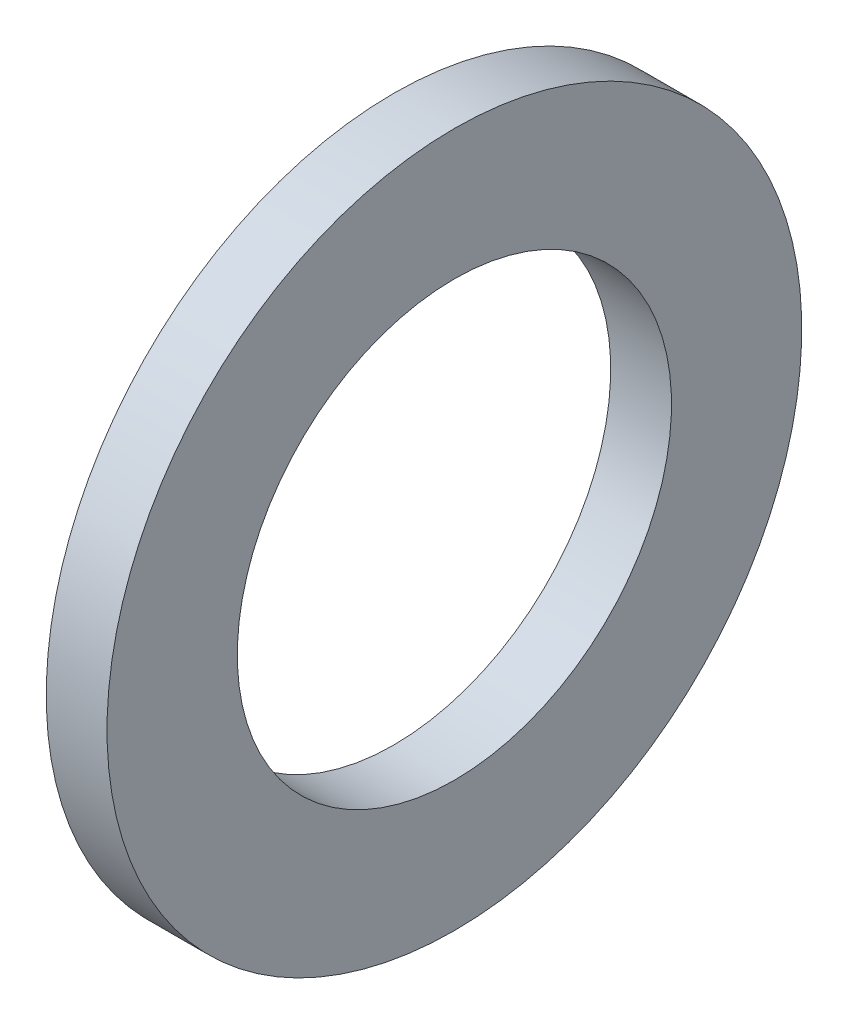
ISO-10303-21;
HEADER;
FILE_DESCRIPTION(('STEP AP214'),'2;1');
FILE_NAME('part.step','',(''),(''),'','','');
FILE_SCHEMA(('AUTOMOTIVE_DESIGN { 1 0 10303 214 1 1 1 1 }'));
ENDSEC;
DATA;
#1=APPLICATION_CONTEXT('core data for automotive mechanical design processes');
#2=APPLICATION_PROTOCOL_DEFINITION('international standard','automotive_design',2000,#1);
#3=PRODUCT_CONTEXT('',#1,'mechanical');
#4=PRODUCT('Part','Part','',(#3));
#5=PRODUCT_RELATED_PRODUCT_CATEGORY('part','',(#4));
#6=PRODUCT_DEFINITION_FORMATION('','',#4);
#7=PRODUCT_DEFINITION_CONTEXT('part definition',#1,'design');
#8=PRODUCT_DEFINITION('design','',#6,#7);
#9=PRODUCT_DEFINITION_SHAPE('','',#8);
#10=(LENGTH_UNIT() NAMED_UNIT(*) SI_UNIT(.MILLI.,.METRE.));
#11=(NAMED_UNIT(*) PLANE_ANGLE_UNIT() SI_UNIT($,.RADIAN.));
#12=(NAMED_UNIT(*) SI_UNIT($,.STERADIAN.) SOLID_ANGLE_UNIT());
#13=UNCERTAINTY_MEASURE_WITH_UNIT(LENGTH_MEASURE(1.E-05),#10,'distance_accuracy_value','');
#14=(GEOMETRIC_REPRESENTATION_CONTEXT(3) GLOBAL_UNCERTAINTY_ASSIGNED_CONTEXT((#13)) GLOBAL_UNIT_ASSIGNED_CONTEXT((#10,
#11,#12)) REPRESENTATION_CONTEXT('',''));
#15=CARTESIAN_POINT('',(0.,0.,0.));
#16=DIRECTION('',(0.,0.,1.));
#17=DIRECTION('',(1.,0.,0.));
#18=AXIS2_PLACEMENT_3D('',#15,#16,#17);
#19=CARTESIAN_POINT('',(0.7,0.,0.));
#20=DIRECTION('',(1.,0.,0.));
#21=DIRECTION('',(0.,-1.,0.));
#22=AXIS2_PLACEMENT_3D('',#19,#20,#21);
#23=PLANE('',#22);
#24=CARTESIAN_POINT('',(0.7,0.,0.));
#25=DIRECTION('',(1.,0.,0.));
#26=DIRECTION('',(0.,1.,0.));
#27=AXIS2_PLACEMENT_3D('',#24,#25,#26);
#28=CIRCLE('',#27,2.5);
#29=CARTESIAN_POINT('',(0.7,2.5,0.));
#30=VERTEX_POINT('',#29);
#31=EDGE_CURVE('E19',#30,#30,#28,.T.);
#32=ORIENTED_EDGE('',*,*,#31,.F.);
#33=EDGE_LOOP('',(#32));
#34=FACE_BOUND('',#33,.T.);
#35=CARTESIAN_POINT('',(0.7,0.,0.));
#36=DIRECTION('',(1.,0.,0.));
#37=DIRECTION('',(0.,1.,0.));
#38=AXIS2_PLACEMENT_3D('',#35,#36,#37);
#39=CIRCLE('',#38,4.);
#40=CARTESIAN_POINT('',(0.7,4.,0.));
#41=VERTEX_POINT('',#40);
#42=EDGE_CURVE('E57',#41,#41,#39,.T.);
#43=ORIENTED_EDGE('',*,*,#42,.T.);
#44=EDGE_LOOP('',(#43));
#45=FACE_BOUND('',#44,.T.);
#46=ADVANCED_FACE('F16',(#34,#45),#23,.T.);
#47=CARTESIAN_POINT('',(0.,0.,0.));
#48=DIRECTION('',(1.,0.,0.));
#49=DIRECTION('',(0.,-1.,0.));
#50=AXIS2_PLACEMENT_3D('',#47,#48,#49);
#51=PLANE('',#50);
#52=CARTESIAN_POINT('',(0.,0.,0.));
#53=DIRECTION('',(1.,0.,0.));
#54=DIRECTION('',(0.,1.,0.));
#55=AXIS2_PLACEMENT_3D('',#52,#53,#54);
#56=CIRCLE('',#55,2.5);
#57=CARTESIAN_POINT('',(0.,2.5,0.));
#58=VERTEX_POINT('',#57);
#59=EDGE_CURVE('E10',#58,#58,#56,.T.);
#60=ORIENTED_EDGE('',*,*,#59,.T.);
#61=EDGE_LOOP('',(#60));
#62=FACE_BOUND('',#61,.T.);
#63=CARTESIAN_POINT('',(0.,0.,0.));
#64=DIRECTION('',(1.,0.,0.));
#65=DIRECTION('',(0.,1.,0.));
#66=AXIS2_PLACEMENT_3D('',#63,#64,#65);
#67=CIRCLE('',#66,4.);
#68=CARTESIAN_POINT('',(0.,4.,0.));
#69=VERTEX_POINT('',#68);
#70=EDGE_CURVE('E56',#69,#69,#67,.T.);
#71=ORIENTED_EDGE('',*,*,#70,.F.);
#72=EDGE_LOOP('',(#71));
#73=FACE_BOUND('',#72,.T.);
#74=ADVANCED_FACE('F85',(#62,#73),#51,.F.);
#75=CARTESIAN_POINT('',(0.,0.,0.));
#76=DIRECTION('',(-1.,0.,0.));
#77=DIRECTION('',(0.,1.,0.));
#78=AXIS2_PLACEMENT_3D('',#75,#76,#77);
#79=CYLINDRICAL_SURFACE('',#78,2.5);
#80=DIRECTION('',(1.,0.,0.));
#81=VECTOR('',#80,1.);
#82=CARTESIAN_POINT('',(0.,2.5,0.));
#83=LINE('',#82,#81);
#84=EDGE_CURVE('E65',#58,#30,#83,.T.);
#85=ORIENTED_EDGE('',*,*,#84,.T.);
#86=ORIENTED_EDGE('',*,*,#31,.T.);
#87=ORIENTED_EDGE('',*,*,#84,.F.);
#88=ORIENTED_EDGE('',*,*,#59,.F.);
#89=EDGE_LOOP('',(#85,#86,#87,#88));
#90=FACE_BOUND('',#89,.T.);
#91=ADVANCED_FACE('F90',(#90),#79,.F.);
#92=CARTESIAN_POINT('',(0.,0.,0.));
#93=DIRECTION('',(-1.,0.,0.));
#94=DIRECTION('',(0.,1.,0.));
#95=AXIS2_PLACEMENT_3D('',#92,#93,#94);
#96=CYLINDRICAL_SURFACE('',#95,4.);
#97=ORIENTED_EDGE('',*,*,#70,.T.);
#98=DIRECTION('',(1.,0.,0.));
#99=VECTOR('',#98,1.);
#100=CARTESIAN_POINT('',(0.,4.,0.));
#101=LINE('',#100,#99);
#102=EDGE_CURVE('E53',#69,#41,#101,.T.);
#103=ORIENTED_EDGE('',*,*,#102,.T.);
#104=ORIENTED_EDGE('',*,*,#42,.F.);
#105=ORIENTED_EDGE('',*,*,#102,.F.);
#106=EDGE_LOOP('',(#97,#103,#104,#105));
#107=FACE_BOUND('',#106,.T.);
#108=ADVANCED_FACE('F54',(#107),#96,.T.);
#109=CLOSED_SHELL('',(#46,#74,#91,#108));
#110=MANIFOLD_SOLID_BREP('B1',#109);
#111=ADVANCED_BREP_SHAPE_REPRESENTATION('',(#18,#110),#14);
#112=SHAPE_DEFINITION_REPRESENTATION(#9,#111);
ENDSEC;
END-ISO-10303-21;
